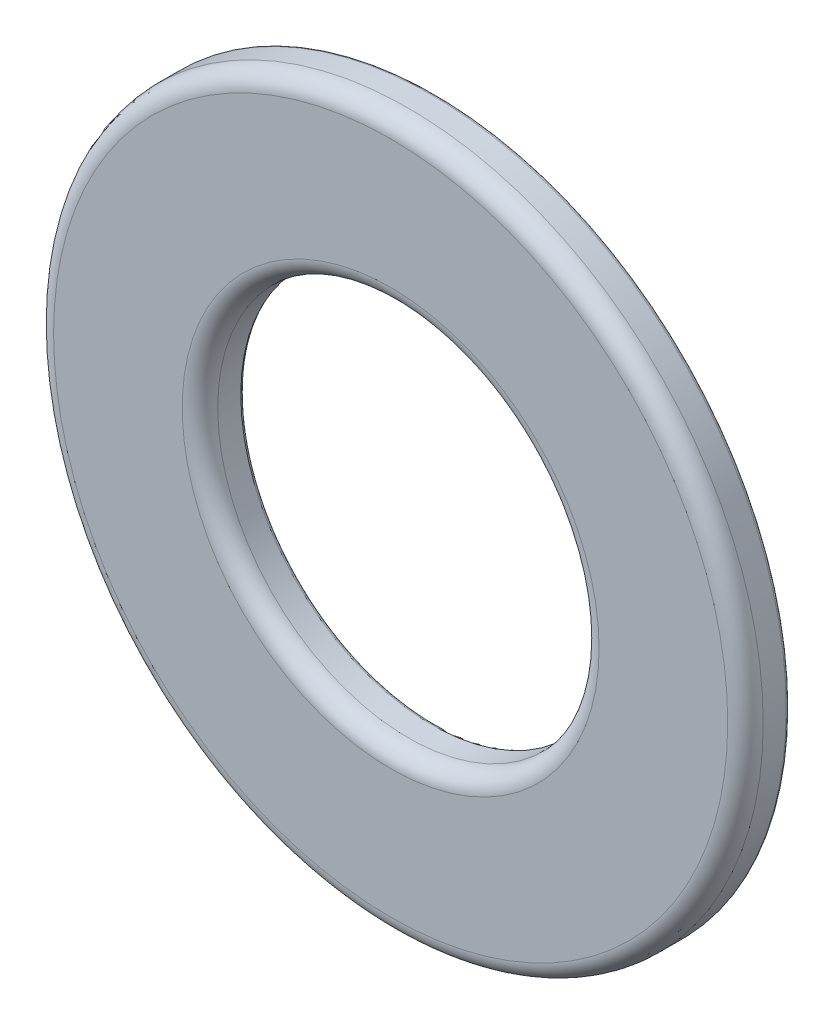
ISO-10303-21;
HEADER;
FILE_DESCRIPTION(('STEP AP214'),'2;1');
FILE_NAME('part.step','',(''),(''),'','','');
FILE_SCHEMA(('AUTOMOTIVE_DESIGN { 1 0 10303 214 1 1 1 1 }'));
ENDSEC;
DATA;
#1=APPLICATION_CONTEXT('core data for automotive mechanical design processes');
#2=APPLICATION_PROTOCOL_DEFINITION('international standard','automotive_design',2000,#1);
#3=PRODUCT_CONTEXT('',#1,'mechanical');
#4=PRODUCT('Part','Part','',(#3));
#5=PRODUCT_RELATED_PRODUCT_CATEGORY('part','',(#4));
#6=PRODUCT_DEFINITION_FORMATION('','',#4);
#7=PRODUCT_DEFINITION_CONTEXT('part definition',#1,'design');
#8=PRODUCT_DEFINITION('design','',#6,#7);
#9=PRODUCT_DEFINITION_SHAPE('','',#8);
#10=(LENGTH_UNIT() NAMED_UNIT(*) SI_UNIT(.MILLI.,.METRE.));
#11=(NAMED_UNIT(*) PLANE_ANGLE_UNIT() SI_UNIT($,.RADIAN.));
#12=(NAMED_UNIT(*) SI_UNIT($,.STERADIAN.) SOLID_ANGLE_UNIT());
#13=UNCERTAINTY_MEASURE_WITH_UNIT(LENGTH_MEASURE(1.E-05),#10,'distance_accuracy_value','');
#14=(GEOMETRIC_REPRESENTATION_CONTEXT(3) GLOBAL_UNCERTAINTY_ASSIGNED_CONTEXT((#13)) GLOBAL_UNIT_ASSIGNED_CONTEXT((#10,
#11,#12)) REPRESENTATION_CONTEXT('',''));
#15=CARTESIAN_POINT('',(0.,0.,0.));
#16=DIRECTION('',(0.,0.,1.));
#17=DIRECTION('',(1.,0.,0.));
#18=AXIS2_PLACEMENT_3D('',#15,#16,#17);
#19=CARTESIAN_POINT('',(0.,0.,-0.25));
#20=DIRECTION('',(0.,0.,1.));
#21=DIRECTION('',(1.,0.,0.));
#22=AXIS2_PLACEMENT_3D('',#19,#20,#21);
#23=CYLINDRICAL_SURFACE('',#22,4.);
#24=CARTESIAN_POINT('',(0.,0.,-0.21));
#25=DIRECTION('',(0.,0.,1.));
#26=DIRECTION('',(1.,0.,0.));
#27=AXIS2_PLACEMENT_3D('',#24,#25,#26);
#28=CIRCLE('',#27,4.);
#29=CARTESIAN_POINT('',(4.,0.,-0.21));
#30=VERTEX_POINT('',#29);
#31=EDGE_CURVE('E96',#30,#30,#28,.T.);
#32=ORIENTED_EDGE('',*,*,#31,.T.);
#33=EDGE_LOOP('',(#32));
#34=FACE_BOUND('',#33,.T.);
#35=CARTESIAN_POINT('',(0.,0.,0.05));
#36=DIRECTION('',(0.,0.,1.));
#37=DIRECTION('',(1.,0.,0.));
#38=AXIS2_PLACEMENT_3D('',#35,#36,#37);
#39=CIRCLE('',#38,4.);
#40=CARTESIAN_POINT('',(4.,0.,0.05));
#41=VERTEX_POINT('',#40);
#42=EDGE_CURVE('E101',#41,#41,#39,.F.);
#43=ORIENTED_EDGE('',*,*,#42,.T.);
#44=EDGE_LOOP('',(#43));
#45=FACE_BOUND('',#44,.T.);
#46=ADVANCED_FACE('F81',(#34,#45),#23,.T.);
#47=CARTESIAN_POINT('',(0.,0.,-0.25));
#48=DIRECTION('',(0.,0.,1.));
#49=DIRECTION('',(1.,0.,0.));
#50=AXIS2_PLACEMENT_3D('',#47,#48,#49);
#51=PLANE('',#50);
#52=CARTESIAN_POINT('',(0.,0.,-0.25));
#53=DIRECTION('',(0.,0.,1.));
#54=DIRECTION('',(1.,0.,0.));
#55=AXIS2_PLACEMENT_3D('',#52,#53,#54);
#56=CIRCLE('',#55,3.96);
#57=CARTESIAN_POINT('',(3.96,0.,-0.25));
#58=VERTEX_POINT('',#57);
#59=EDGE_CURVE('E88',#58,#58,#56,.F.);
#60=ORIENTED_EDGE('',*,*,#59,.T.);
#61=EDGE_LOOP('',(#60));
#62=FACE_BOUND('',#61,.T.);
#63=CARTESIAN_POINT('',(0.,0.,-0.25));
#64=DIRECTION('',(0.,0.,1.));
#65=DIRECTION('',(1.,0.,0.));
#66=AXIS2_PLACEMENT_3D('',#63,#64,#65);
#67=CIRCLE('',#66,2.19);
#68=CARTESIAN_POINT('',(2.19,0.,-0.25));
#69=VERTEX_POINT('',#68);
#70=EDGE_CURVE('E92',#69,#69,#67,.T.);
#71=ORIENTED_EDGE('',*,*,#70,.T.);
#72=EDGE_LOOP('',(#71));
#73=FACE_BOUND('',#72,.T.);
#74=ADVANCED_FACE('F134',(#62,#73),#51,.F.);
#75=CARTESIAN_POINT('',(0.,0.,-0.25));
#76=DIRECTION('',(0.,0.,1.));
#77=DIRECTION('',(1.,0.,0.));
#78=AXIS2_PLACEMENT_3D('',#75,#76,#77);
#79=CYLINDRICAL_SURFACE('',#78,2.15);
#80=CARTESIAN_POINT('',(0.,0.,-0.21));
#81=DIRECTION('',(0.,0.,1.));
#82=DIRECTION('',(1.,0.,0.));
#83=AXIS2_PLACEMENT_3D('',#80,#81,#82);
#84=CIRCLE('',#83,2.15);
#85=CARTESIAN_POINT('',(2.15,0.,-0.21));
#86=VERTEX_POINT('',#85);
#87=EDGE_CURVE('E11',#86,#86,#84,.F.);
#88=ORIENTED_EDGE('',*,*,#87,.T.);
#89=EDGE_LOOP('',(#88));
#90=FACE_BOUND('',#89,.T.);
#91=CARTESIAN_POINT('',(0.,0.,0.05));
#92=DIRECTION('',(0.,0.,1.));
#93=DIRECTION('',(1.,0.,0.));
#94=AXIS2_PLACEMENT_3D('',#91,#92,#93);
#95=CIRCLE('',#94,2.15);
#96=CARTESIAN_POINT('',(2.15,0.,0.05));
#97=VERTEX_POINT('',#96);
#98=EDGE_CURVE('E110',#97,#97,#95,.T.);
#99=ORIENTED_EDGE('',*,*,#98,.T.);
#100=EDGE_LOOP('',(#99));
#101=FACE_BOUND('',#100,.T.);
#102=ADVANCED_FACE('F114',(#90,#101),#79,.F.);
#103=CARTESIAN_POINT('',(0.,0.,0.25));
#104=DIRECTION('',(0.,0.,1.));
#105=DIRECTION('',(1.,0.,0.));
#106=AXIS2_PLACEMENT_3D('',#103,#104,#105);
#107=PLANE('',#106);
#108=CARTESIAN_POINT('',(0.,0.,0.25));
#109=DIRECTION('',(0.,0.,1.));
#110=DIRECTION('',(1.,0.,0.));
#111=AXIS2_PLACEMENT_3D('',#108,#109,#110);
#112=CIRCLE('',#111,2.35);
#113=CARTESIAN_POINT('',(2.35,0.,0.25));
#114=VERTEX_POINT('',#113);
#115=EDGE_CURVE('E104',#114,#114,#112,.F.);
#116=ORIENTED_EDGE('',*,*,#115,.T.);
#117=EDGE_LOOP('',(#116));
#118=FACE_BOUND('',#117,.T.);
#119=CARTESIAN_POINT('',(0.,0.,0.25));
#120=DIRECTION('',(0.,0.,1.));
#121=DIRECTION('',(1.,0.,0.));
#122=AXIS2_PLACEMENT_3D('',#119,#120,#121);
#123=CIRCLE('',#122,3.8);
#124=CARTESIAN_POINT('',(3.8,0.,0.25));
#125=VERTEX_POINT('',#124);
#126=EDGE_CURVE('E107',#125,#125,#123,.T.);
#127=ORIENTED_EDGE('',*,*,#126,.T.);
#128=EDGE_LOOP('',(#127));
#129=FACE_BOUND('',#128,.T.);
#130=ADVANCED_FACE('F119',(#118,#129),#107,.T.);
#131=CARTESIAN_POINT('',(0.,0.,0.05));
#132=DIRECTION('',(0.,0.,1.));
#133=DIRECTION('',(1.,0.,0.));
#134=AXIS2_PLACEMENT_3D('',#131,#132,#133);
#135=TOROIDAL_SURFACE('',#134,2.35,0.2);
#136=ORIENTED_EDGE('',*,*,#115,.F.);
#137=EDGE_LOOP('',(#136));
#138=FACE_BOUND('',#137,.T.);
#139=ORIENTED_EDGE('',*,*,#98,.F.);
#140=EDGE_LOOP('',(#139));
#141=FACE_BOUND('',#140,.T.);
#142=ADVANCED_FACE('F116',(#138,#141),#135,.T.);
#143=CARTESIAN_POINT('',(0.,0.,0.05));
#144=DIRECTION('',(0.,0.,1.));
#145=DIRECTION('',(1.,0.,0.));
#146=AXIS2_PLACEMENT_3D('',#143,#144,#145);
#147=TOROIDAL_SURFACE('',#146,3.8,0.2);
#148=ORIENTED_EDGE('',*,*,#42,.F.);
#149=EDGE_LOOP('',(#148));
#150=FACE_BOUND('',#149,.T.);
#151=ORIENTED_EDGE('',*,*,#126,.F.);
#152=EDGE_LOOP('',(#151));
#153=FACE_BOUND('',#152,.T.);
#154=ADVANCED_FACE('F118',(#150,#153),#147,.T.);
#155=CARTESIAN_POINT('',(0.,0.,-0.21));
#156=DIRECTION('',(0.,0.,1.));
#157=DIRECTION('',(1.,0.,0.));
#158=AXIS2_PLACEMENT_3D('',#155,#156,#157);
#159=TOROIDAL_SURFACE('',#158,3.96,0.04);
#160=ORIENTED_EDGE('',*,*,#59,.F.);
#161=EDGE_LOOP('',(#160));
#162=FACE_BOUND('',#161,.T.);
#163=ORIENTED_EDGE('',*,*,#31,.F.);
#164=EDGE_LOOP('',(#163));
#165=FACE_BOUND('',#164,.T.);
#166=ADVANCED_FACE('F126',(#162,#165),#159,.T.);
#167=CARTESIAN_POINT('',(0.,0.,-0.21));
#168=DIRECTION('',(0.,0.,1.));
#169=DIRECTION('',(1.,0.,0.));
#170=AXIS2_PLACEMENT_3D('',#167,#168,#169);
#171=TOROIDAL_SURFACE('',#170,2.19,0.04);
#172=ORIENTED_EDGE('',*,*,#87,.F.);
#173=EDGE_LOOP('',(#172));
#174=FACE_BOUND('',#173,.T.);
#175=ORIENTED_EDGE('',*,*,#70,.F.);
#176=EDGE_LOOP('',(#175));
#177=FACE_BOUND('',#176,.T.);
#178=ADVANCED_FACE('F83',(#174,#177),#171,.T.);
#179=CLOSED_SHELL('',(#46,#74,#102,#130,#142,#154,#166,#178));
#180=MANIFOLD_SOLID_BREP('B2',#179);
#181=ADVANCED_BREP_SHAPE_REPRESENTATION('',(#18,#180),#14);
#182=SHAPE_DEFINITION_REPRESENTATION(#9,#181);
ENDSEC;
END-ISO-10303-21;
